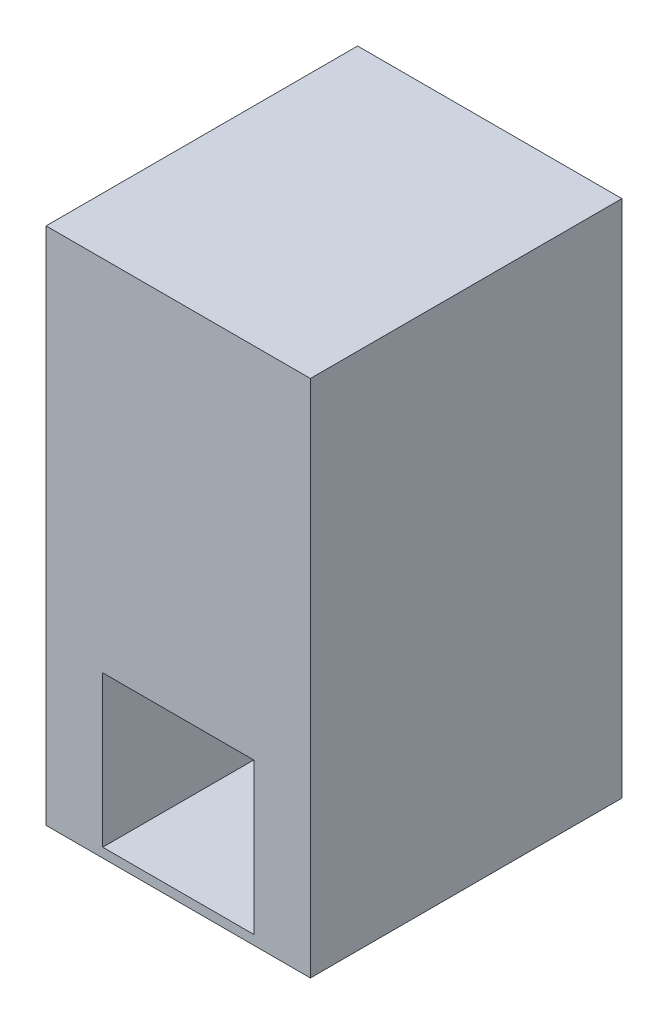
ISO-10303-21;
HEADER;
FILE_DESCRIPTION(('STEP AP214'),'2;1');
FILE_NAME('part.step','',(''),(''),'','','');
FILE_SCHEMA(('AUTOMOTIVE_DESIGN { 1 0 10303 214 1 1 1 1 }'));
ENDSEC;
DATA;
#1=APPLICATION_CONTEXT('core data for automotive mechanical design processes');
#2=APPLICATION_PROTOCOL_DEFINITION('international standard','automotive_design',2000,#1);
#3=PRODUCT_CONTEXT('',#1,'mechanical');
#4=PRODUCT('Part','Part','',(#3));
#5=PRODUCT_RELATED_PRODUCT_CATEGORY('part','',(#4));
#6=PRODUCT_DEFINITION_FORMATION('','',#4);
#7=PRODUCT_DEFINITION_CONTEXT('part definition',#1,'design');
#8=PRODUCT_DEFINITION('design','',#6,#7);
#9=PRODUCT_DEFINITION_SHAPE('','',#8);
#10=(LENGTH_UNIT() NAMED_UNIT(*) SI_UNIT(.MILLI.,.METRE.));
#11=(NAMED_UNIT(*) PLANE_ANGLE_UNIT() SI_UNIT($,.RADIAN.));
#12=(NAMED_UNIT(*) SI_UNIT($,.STERADIAN.) SOLID_ANGLE_UNIT());
#13=UNCERTAINTY_MEASURE_WITH_UNIT(LENGTH_MEASURE(1.E-05),#10,'distance_accuracy_value','');
#14=(GEOMETRIC_REPRESENTATION_CONTEXT(3) GLOBAL_UNCERTAINTY_ASSIGNED_CONTEXT((#13)) GLOBAL_UNIT_ASSIGNED_CONTEXT((#10,
#11,#12)) REPRESENTATION_CONTEXT('',''));
#15=CARTESIAN_POINT('',(0.,0.,0.));
#16=DIRECTION('',(0.,0.,1.));
#17=DIRECTION('',(1.,0.,0.));
#18=AXIS2_PLACEMENT_3D('',#15,#16,#17);
#19=CARTESIAN_POINT('',(-355.6,1397.,419.1));
#20=DIRECTION('',(1.,0.,0.));
#21=DIRECTION('',(0.,0.,-1.));
#22=AXIS2_PLACEMENT_3D('',#19,#20,#21);
#23=PLANE('',#22);
#24=DIRECTION('',(0.,0.,1.));
#25=VECTOR('',#24,1.);
#26=CARTESIAN_POINT('',(-355.6,0.,419.1));
#27=LINE('',#26,#25);
#28=CARTESIAN_POINT('',(-355.6,0.,-419.1));
#29=VERTEX_POINT('',#28);
#30=CARTESIAN_POINT('',(-355.6,0.,419.1));
#31=VERTEX_POINT('',#30);
#32=EDGE_CURVE('E141',#29,#31,#27,.T.);
#33=ORIENTED_EDGE('',*,*,#32,.T.);
#34=DIRECTION('',(0.,-1.,0.));
#35=VECTOR('',#34,1.);
#36=CARTESIAN_POINT('',(-355.6,1397.,419.1));
#37=LINE('',#36,#35);
#38=CARTESIAN_POINT('',(-355.6,1397.,419.1));
#39=VERTEX_POINT('',#38);
#40=EDGE_CURVE('E11',#39,#31,#37,.T.);
#41=ORIENTED_EDGE('',*,*,#40,.F.);
#42=DIRECTION('',(0.,0.,1.));
#43=VECTOR('',#42,1.);
#44=CARTESIAN_POINT('',(-355.6,1397.,419.1));
#45=LINE('',#44,#43);
#46=CARTESIAN_POINT('',(-355.6,1397.,-419.1));
#47=VERTEX_POINT('',#46);
#48=EDGE_CURVE('E145',#47,#39,#45,.T.);
#49=ORIENTED_EDGE('',*,*,#48,.F.);
#50=DIRECTION('',(0.,-1.,0.));
#51=VECTOR('',#50,1.);
#52=CARTESIAN_POINT('',(-355.6,1397.,-419.1));
#53=LINE('',#52,#51);
#54=EDGE_CURVE('E151',#47,#29,#53,.T.);
#55=ORIENTED_EDGE('',*,*,#54,.T.);
#56=EDGE_LOOP('',(#33,#41,#49,#55));
#57=FACE_BOUND('',#56,.T.);
#58=ADVANCED_FACE('F33',(#57),#23,.F.);
#59=CARTESIAN_POINT('',(-355.6,1397.,419.1));
#60=DIRECTION('',(0.,0.,-1.));
#61=DIRECTION('',(-1.,0.,0.));
#62=AXIS2_PLACEMENT_3D('',#59,#60,#61);
#63=PLANE('',#62);
#64=DIRECTION('',(-1.,0.,0.));
#65=VECTOR('',#64,1.);
#66=CARTESIAN_POINT('',(203.2,431.8,419.1));
#67=LINE('',#66,#65);
#68=CARTESIAN_POINT('',(203.2,431.8,419.1));
#69=VERTEX_POINT('',#68);
#70=CARTESIAN_POINT('',(-203.2,431.8,419.1));
#71=VERTEX_POINT('',#70);
#72=EDGE_CURVE('E135',#69,#71,#67,.T.);
#73=ORIENTED_EDGE('',*,*,#72,.F.);
#74=DIRECTION('',(0.,1.,0.));
#75=VECTOR('',#74,1.);
#76=CARTESIAN_POINT('',(203.2,25.4,419.1));
#77=LINE('',#76,#75);
#78=CARTESIAN_POINT('',(203.2,25.4,419.1));
#79=VERTEX_POINT('',#78);
#80=EDGE_CURVE('E47',#79,#69,#77,.T.);
#81=ORIENTED_EDGE('',*,*,#80,.F.);
#82=DIRECTION('',(1.,0.,0.));
#83=VECTOR('',#82,1.);
#84=CARTESIAN_POINT('',(203.2,25.4,419.1));
#85=LINE('',#84,#83);
#86=CARTESIAN_POINT('',(-203.2,25.4,419.1));
#87=VERTEX_POINT('',#86);
#88=EDGE_CURVE('E126',#87,#79,#85,.T.);
#89=ORIENTED_EDGE('',*,*,#88,.F.);
#90=DIRECTION('',(0.,-1.,0.));
#91=VECTOR('',#90,1.);
#92=CARTESIAN_POINT('',(-203.2,25.4,419.1));
#93=LINE('',#92,#91);
#94=EDGE_CURVE('E129',#71,#87,#93,.T.);
#95=ORIENTED_EDGE('',*,*,#94,.F.);
#96=EDGE_LOOP('',(#73,#81,#89,#95));
#97=FACE_BOUND('',#96,.T.);
#98=DIRECTION('',(1.,0.,0.));
#99=VECTOR('',#98,1.);
#100=CARTESIAN_POINT('',(-355.6,0.,419.1));
#101=LINE('',#100,#99);
#102=CARTESIAN_POINT('',(355.6,0.,419.1));
#103=VERTEX_POINT('',#102);
#104=EDGE_CURVE('E154',#31,#103,#101,.T.);
#105=ORIENTED_EDGE('',*,*,#104,.T.);
#106=DIRECTION('',(0.,-1.,0.));
#107=VECTOR('',#106,1.);
#108=CARTESIAN_POINT('',(355.6,1397.,419.1));
#109=LINE('',#108,#107);
#110=CARTESIAN_POINT('',(355.6,1397.,419.1));
#111=VERTEX_POINT('',#110);
#112=EDGE_CURVE('E40',#111,#103,#109,.T.);
#113=ORIENTED_EDGE('',*,*,#112,.F.);
#114=DIRECTION('',(1.,0.,0.));
#115=VECTOR('',#114,1.);
#116=CARTESIAN_POINT('',(-355.6,1397.,419.1));
#117=LINE('',#116,#115);
#118=EDGE_CURVE('E84',#39,#111,#117,.T.);
#119=ORIENTED_EDGE('',*,*,#118,.F.);
#120=ORIENTED_EDGE('',*,*,#40,.T.);
#121=EDGE_LOOP('',(#105,#113,#119,#120));
#122=FACE_BOUND('',#121,.T.);
#123=ADVANCED_FACE('F182',(#97,#122),#63,.F.);
#124=CARTESIAN_POINT('',(355.6,1397.,419.1));
#125=DIRECTION('',(-1.,0.,0.));
#126=DIRECTION('',(0.,0.,1.));
#127=AXIS2_PLACEMENT_3D('',#124,#125,#126);
#128=PLANE('',#127);
#129=DIRECTION('',(0.,0.,-1.));
#130=VECTOR('',#129,1.);
#131=CARTESIAN_POINT('',(355.6,0.,419.1));
#132=LINE('',#131,#130);
#133=CARTESIAN_POINT('',(355.6,0.,-419.1));
#134=VERTEX_POINT('',#133);
#135=EDGE_CURVE('E156',#103,#134,#132,.T.);
#136=ORIENTED_EDGE('',*,*,#135,.T.);
#137=DIRECTION('',(0.,-1.,0.));
#138=VECTOR('',#137,1.);
#139=CARTESIAN_POINT('',(355.6,1397.,-419.1));
#140=LINE('',#139,#138);
#141=CARTESIAN_POINT('',(355.6,1397.,-419.1));
#142=VERTEX_POINT('',#141);
#143=EDGE_CURVE('E160',#142,#134,#140,.T.);
#144=ORIENTED_EDGE('',*,*,#143,.F.);
#145=DIRECTION('',(0.,0.,-1.));
#146=VECTOR('',#145,1.);
#147=CARTESIAN_POINT('',(355.6,1397.,419.1));
#148=LINE('',#147,#146);
#149=EDGE_CURVE('E148',#111,#142,#148,.T.);
#150=ORIENTED_EDGE('',*,*,#149,.F.);
#151=ORIENTED_EDGE('',*,*,#112,.T.);
#152=EDGE_LOOP('',(#136,#144,#150,#151));
#153=FACE_BOUND('',#152,.T.);
#154=ADVANCED_FACE('F165',(#153),#128,.F.);
#155=CARTESIAN_POINT('',(-355.6,1397.,-419.1));
#156=DIRECTION('',(0.,0.,1.));
#157=DIRECTION('',(1.,0.,0.));
#158=AXIS2_PLACEMENT_3D('',#155,#156,#157);
#159=PLANE('',#158);
#160=DIRECTION('',(-1.,0.,0.));
#161=VECTOR('',#160,1.);
#162=CARTESIAN_POINT('',(-355.6,0.,-419.1));
#163=LINE('',#162,#161);
#164=EDGE_CURVE('E77',#134,#29,#163,.T.);
#165=ORIENTED_EDGE('',*,*,#164,.T.);
#166=ORIENTED_EDGE('',*,*,#54,.F.);
#167=DIRECTION('',(-1.,0.,0.));
#168=VECTOR('',#167,1.);
#169=CARTESIAN_POINT('',(-355.6,1397.,-419.1));
#170=LINE('',#169,#168);
#171=EDGE_CURVE('E56',#142,#47,#170,.T.);
#172=ORIENTED_EDGE('',*,*,#171,.F.);
#173=ORIENTED_EDGE('',*,*,#143,.T.);
#174=EDGE_LOOP('',(#165,#166,#172,#173));
#175=FACE_BOUND('',#174,.T.);
#176=ADVANCED_FACE('F173',(#175),#159,.F.);
#177=CARTESIAN_POINT('',(0.,1397.,0.));
#178=DIRECTION('',(0.,-1.,0.));
#179=DIRECTION('',(0.,0.,-1.));
#180=AXIS2_PLACEMENT_3D('',#177,#178,#179);
#181=PLANE('',#180);
#182=ORIENTED_EDGE('',*,*,#48,.T.);
#183=ORIENTED_EDGE('',*,*,#118,.T.);
#184=ORIENTED_EDGE('',*,*,#149,.T.);
#185=ORIENTED_EDGE('',*,*,#171,.T.);
#186=EDGE_LOOP('',(#182,#183,#184,#185));
#187=FACE_BOUND('',#186,.T.);
#188=ADVANCED_FACE('F175',(#187),#181,.F.);
#189=CARTESIAN_POINT('',(0.,0.,0.));
#190=DIRECTION('',(0.,-1.,0.));
#191=DIRECTION('',(0.,0.,-1.));
#192=AXIS2_PLACEMENT_3D('',#189,#190,#191);
#193=PLANE('',#192);
#194=ORIENTED_EDGE('',*,*,#32,.F.);
#195=ORIENTED_EDGE('',*,*,#164,.F.);
#196=ORIENTED_EDGE('',*,*,#135,.F.);
#197=ORIENTED_EDGE('',*,*,#104,.F.);
#198=EDGE_LOOP('',(#194,#195,#196,#197));
#199=FACE_BOUND('',#198,.T.);
#200=ADVANCED_FACE('F169',(#199),#193,.T.);
#201=CARTESIAN_POINT('',(203.2,25.4,-190.5));
#202=DIRECTION('',(1.,0.,0.));
#203=DIRECTION('',(0.,0.,-1.));
#204=AXIS2_PLACEMENT_3D('',#201,#202,#203);
#205=PLANE('',#204);
#206=ORIENTED_EDGE('',*,*,#80,.T.);
#207=DIRECTION('',(0.,0.,1.));
#208=VECTOR('',#207,1.);
#209=CARTESIAN_POINT('',(203.2,431.8,-190.5));
#210=LINE('',#209,#208);
#211=CARTESIAN_POINT('',(203.2,431.8,-190.5));
#212=VERTEX_POINT('',#211);
#213=EDGE_CURVE('E104',#212,#69,#210,.T.);
#214=ORIENTED_EDGE('',*,*,#213,.F.);
#215=DIRECTION('',(0.,1.,0.));
#216=VECTOR('',#215,1.);
#217=CARTESIAN_POINT('',(203.2,25.4,-190.5));
#218=LINE('',#217,#216);
#219=CARTESIAN_POINT('',(203.2,25.4,-190.5));
#220=VERTEX_POINT('',#219);
#221=EDGE_CURVE('E108',#220,#212,#218,.T.);
#222=ORIENTED_EDGE('',*,*,#221,.F.);
#223=DIRECTION('',(0.,0.,1.));
#224=VECTOR('',#223,1.);
#225=CARTESIAN_POINT('',(203.2,25.4,-190.5));
#226=LINE('',#225,#224);
#227=EDGE_CURVE('E139',#220,#79,#226,.T.);
#228=ORIENTED_EDGE('',*,*,#227,.T.);
#229=EDGE_LOOP('',(#206,#214,#222,#228));
#230=FACE_BOUND('',#229,.T.);
#231=ADVANCED_FACE('F106',(#230),#205,.F.);
#232=CARTESIAN_POINT('',(203.2,25.4,-190.5));
#233=DIRECTION('',(0.,-1.,0.));
#234=DIRECTION('',(1.,0.,0.));
#235=AXIS2_PLACEMENT_3D('',#232,#233,#234);
#236=PLANE('',#235);
#237=ORIENTED_EDGE('',*,*,#88,.T.);
#238=ORIENTED_EDGE('',*,*,#227,.F.);
#239=DIRECTION('',(1.,0.,0.));
#240=VECTOR('',#239,1.);
#241=CARTESIAN_POINT('',(203.2,25.4,-190.5));
#242=LINE('',#241,#240);
#243=CARTESIAN_POINT('',(-203.2,25.4,-190.5));
#244=VERTEX_POINT('',#243);
#245=EDGE_CURVE('E114',#244,#220,#242,.T.);
#246=ORIENTED_EDGE('',*,*,#245,.F.);
#247=DIRECTION('',(0.,0.,1.));
#248=VECTOR('',#247,1.);
#249=CARTESIAN_POINT('',(-203.2,25.4,-190.5));
#250=LINE('',#249,#248);
#251=EDGE_CURVE('E142',#244,#87,#250,.T.);
#252=ORIENTED_EDGE('',*,*,#251,.T.);
#253=EDGE_LOOP('',(#237,#238,#246,#252));
#254=FACE_BOUND('',#253,.T.);
#255=ADVANCED_FACE('F197',(#254),#236,.F.);
#256=CARTESIAN_POINT('',(-203.2,25.4,-190.5));
#257=DIRECTION('',(-1.,0.,0.));
#258=DIRECTION('',(0.,-1.,0.));
#259=AXIS2_PLACEMENT_3D('',#256,#257,#258);
#260=PLANE('',#259);
#261=ORIENTED_EDGE('',*,*,#94,.T.);
#262=ORIENTED_EDGE('',*,*,#251,.F.);
#263=DIRECTION('',(0.,-1.,0.));
#264=VECTOR('',#263,1.);
#265=CARTESIAN_POINT('',(-203.2,25.4,-190.5));
#266=LINE('',#265,#264);
#267=CARTESIAN_POINT('',(-203.2,431.8,-190.5));
#268=VERTEX_POINT('',#267);
#269=EDGE_CURVE('E122',#268,#244,#266,.T.);
#270=ORIENTED_EDGE('',*,*,#269,.F.);
#271=DIRECTION('',(0.,0.,1.));
#272=VECTOR('',#271,1.);
#273=CARTESIAN_POINT('',(-203.2,431.8,-190.5));
#274=LINE('',#273,#272);
#275=EDGE_CURVE('E113',#268,#71,#274,.T.);
#276=ORIENTED_EDGE('',*,*,#275,.T.);
#277=EDGE_LOOP('',(#261,#262,#270,#276));
#278=FACE_BOUND('',#277,.T.);
#279=ADVANCED_FACE('F195',(#278),#260,.F.);
#280=CARTESIAN_POINT('',(203.2,431.8,-190.5));
#281=DIRECTION('',(0.,1.,0.));
#282=DIRECTION('',(-1.,0.,0.));
#283=AXIS2_PLACEMENT_3D('',#280,#281,#282);
#284=PLANE('',#283);
#285=ORIENTED_EDGE('',*,*,#72,.T.);
#286=ORIENTED_EDGE('',*,*,#275,.F.);
#287=DIRECTION('',(-1.,0.,0.));
#288=VECTOR('',#287,1.);
#289=CARTESIAN_POINT('',(203.2,431.8,-190.5));
#290=LINE('',#289,#288);
#291=EDGE_CURVE('E117',#212,#268,#290,.T.);
#292=ORIENTED_EDGE('',*,*,#291,.F.);
#293=ORIENTED_EDGE('',*,*,#213,.T.);
#294=EDGE_LOOP('',(#285,#286,#292,#293));
#295=FACE_BOUND('',#294,.T.);
#296=ADVANCED_FACE('F118',(#295),#284,.F.);
#297=CARTESIAN_POINT('',(0.,0.,-190.5));
#298=DIRECTION('',(0.,0.,1.));
#299=DIRECTION('',(1.,0.,0.));
#300=AXIS2_PLACEMENT_3D('',#297,#298,#299);
#301=PLANE('',#300);
#302=ORIENTED_EDGE('',*,*,#221,.T.);
#303=ORIENTED_EDGE('',*,*,#291,.T.);
#304=ORIENTED_EDGE('',*,*,#269,.T.);
#305=ORIENTED_EDGE('',*,*,#245,.T.);
#306=EDGE_LOOP('',(#302,#303,#304,#305));
#307=FACE_BOUND('',#306,.T.);
#308=ADVANCED_FACE('F124',(#307),#301,.T.);
#309=CLOSED_SHELL('',(#58,#123,#154,#176,#188,#200,#231,#255,#279,#296,#308));
#310=MANIFOLD_SOLID_BREP('B2',#309);
#311=ADVANCED_BREP_SHAPE_REPRESENTATION('',(#18,#310),#14);
#312=SHAPE_DEFINITION_REPRESENTATION(#9,#311);
ENDSEC;
END-ISO-10303-21;
